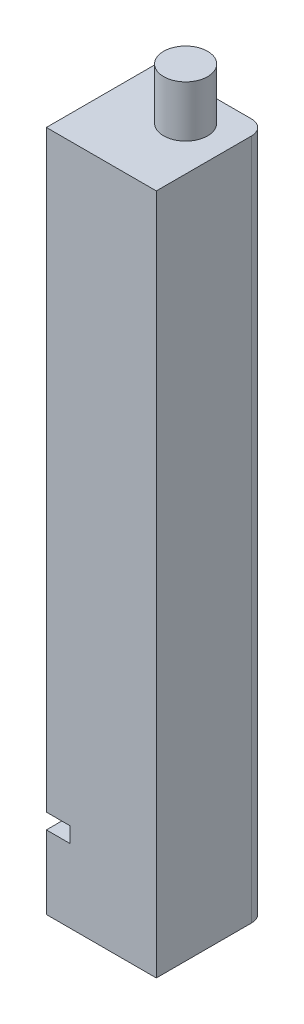
ISO-10303-21;
HEADER;
FILE_DESCRIPTION(('STEP AP214'),'2;1');
FILE_NAME('part.step','',(''),(''),'','','');
FILE_SCHEMA(('AUTOMOTIVE_DESIGN { 1 0 10303 214 1 1 1 1 }'));
ENDSEC;
DATA;
#1=APPLICATION_CONTEXT('core data for automotive mechanical design processes');
#2=APPLICATION_PROTOCOL_DEFINITION('international standard','automotive_design',2000,#1);
#3=PRODUCT_CONTEXT('',#1,'mechanical');
#4=PRODUCT('Part','Part','',(#3));
#5=PRODUCT_RELATED_PRODUCT_CATEGORY('part','',(#4));
#6=PRODUCT_DEFINITION_FORMATION('','',#4);
#7=PRODUCT_DEFINITION_CONTEXT('part definition',#1,'design');
#8=PRODUCT_DEFINITION('design','',#6,#7);
#9=PRODUCT_DEFINITION_SHAPE('','',#8);
#10=(LENGTH_UNIT() NAMED_UNIT(*) SI_UNIT(.MILLI.,.METRE.));
#11=(NAMED_UNIT(*) PLANE_ANGLE_UNIT() SI_UNIT($,.RADIAN.));
#12=(NAMED_UNIT(*) SI_UNIT($,.STERADIAN.) SOLID_ANGLE_UNIT());
#13=UNCERTAINTY_MEASURE_WITH_UNIT(LENGTH_MEASURE(1.E-05),#10,'distance_accuracy_value','');
#14=(GEOMETRIC_REPRESENTATION_CONTEXT(3) GLOBAL_UNCERTAINTY_ASSIGNED_CONTEXT((#13)) GLOBAL_UNIT_ASSIGNED_CONTEXT((#10,
#11,#12)) REPRESENTATION_CONTEXT('',''));
#15=CARTESIAN_POINT('',(0.,0.,0.));
#16=DIRECTION('',(0.,0.,1.));
#17=DIRECTION('',(1.,0.,0.));
#18=AXIS2_PLACEMENT_3D('',#15,#16,#17);
#19=CARTESIAN_POINT('',(-7.5,93.,7.5));
#20=DIRECTION('',(1.,0.,0.));
#21=DIRECTION('',(0.,0.,-1.));
#22=AXIS2_PLACEMENT_3D('',#19,#20,#21);
#23=PLANE('',#22);
#24=DIRECTION('',(0.,-1.,0.));
#25=VECTOR('',#24,1.);
#26=CARTESIAN_POINT('',(-7.5,93.,-7.5));
#27=LINE('',#26,#25);
#28=CARTESIAN_POINT('',(-7.5,93.,-7.5));
#29=VERTEX_POINT('',#28);
#30=CARTESIAN_POINT('',(-7.5,12.1,-7.5));
#31=VERTEX_POINT('',#30);
#32=EDGE_CURVE('E130',#29,#31,#27,.T.);
#33=ORIENTED_EDGE('',*,*,#32,.T.);
#34=DIRECTION('',(0.,0.,1.));
#35=VECTOR('',#34,1.);
#36=CARTESIAN_POINT('',(-7.5,12.1,-7.5));
#37=LINE('',#36,#35);
#38=CARTESIAN_POINT('',(-7.5,12.1,7.5));
#39=VERTEX_POINT('',#38);
#40=EDGE_CURVE('E193',#31,#39,#37,.T.);
#41=ORIENTED_EDGE('',*,*,#40,.T.);
#42=DIRECTION('',(0.,-1.,0.));
#43=VECTOR('',#42,1.);
#44=CARTESIAN_POINT('',(-7.5,93.,7.5));
#45=LINE('',#44,#43);
#46=CARTESIAN_POINT('',(-7.5,93.,7.5));
#47=VERTEX_POINT('',#46);
#48=EDGE_CURVE('E131',#47,#39,#45,.T.);
#49=ORIENTED_EDGE('',*,*,#48,.F.);
#50=DIRECTION('',(0.,0.,1.));
#51=VECTOR('',#50,1.);
#52=CARTESIAN_POINT('',(-7.5,93.,7.5));
#53=LINE('',#52,#51);
#54=EDGE_CURVE('E154',#29,#47,#53,.T.);
#55=ORIENTED_EDGE('',*,*,#54,.F.);
#56=EDGE_LOOP('',(#33,#41,#49,#55));
#57=FACE_BOUND('',#56,.T.);
#58=ADVANCED_FACE('F32',(#57),#23,.F.);
#59=CARTESIAN_POINT('',(7.5,93.,7.5));
#60=DIRECTION('',(-1.,0.,0.));
#61=DIRECTION('',(0.,0.,1.));
#62=AXIS2_PLACEMENT_3D('',#59,#60,#61);
#63=PLANE('',#62);
#64=DIRECTION('',(0.,0.,-1.));
#65=VECTOR('',#64,1.);
#66=CARTESIAN_POINT('',(7.5,0.,7.5));
#67=LINE('',#66,#65);
#68=CARTESIAN_POINT('',(7.5,0.,7.5));
#69=VERTEX_POINT('',#68);
#70=CARTESIAN_POINT('',(7.5,0.,-5.5));
#71=VERTEX_POINT('',#70);
#72=EDGE_CURVE('E159',#69,#71,#67,.T.);
#73=ORIENTED_EDGE('',*,*,#72,.T.);
#74=DIRECTION('',(0.,-1.,0.));
#75=VECTOR('',#74,1.);
#76=CARTESIAN_POINT('',(7.5,93.,-5.5));
#77=LINE('',#76,#75);
#78=CARTESIAN_POINT('',(7.5,93.,-5.5));
#79=VERTEX_POINT('',#78);
#80=EDGE_CURVE('E40',#71,#79,#77,.F.);
#81=ORIENTED_EDGE('',*,*,#80,.T.);
#82=DIRECTION('',(0.,0.,-1.));
#83=VECTOR('',#82,1.);
#84=CARTESIAN_POINT('',(7.5,93.,7.5));
#85=LINE('',#84,#83);
#86=CARTESIAN_POINT('',(7.5,93.,7.5));
#87=VERTEX_POINT('',#86);
#88=EDGE_CURVE('E149',#87,#79,#85,.T.);
#89=ORIENTED_EDGE('',*,*,#88,.F.);
#90=DIRECTION('',(0.,-1.,0.));
#91=VECTOR('',#90,1.);
#92=CARTESIAN_POINT('',(7.5,93.,7.5));
#93=LINE('',#92,#91);
#94=EDGE_CURVE('E158',#87,#69,#93,.T.);
#95=ORIENTED_EDGE('',*,*,#94,.T.);
#96=EDGE_LOOP('',(#73,#81,#89,#95));
#97=FACE_BOUND('',#96,.T.);
#98=ADVANCED_FACE('F172',(#97),#63,.F.);
#99=CARTESIAN_POINT('',(-7.5,93.,-7.5));
#100=DIRECTION('',(0.,0.,1.));
#101=DIRECTION('',(1.,0.,0.));
#102=AXIS2_PLACEMENT_3D('',#99,#100,#101);
#103=PLANE('',#102);
#104=DIRECTION('',(-1.,0.,0.));
#105=VECTOR('',#104,1.);
#106=CARTESIAN_POINT('',(-7.5,93.,-7.5));
#107=LINE('',#106,#105);
#108=CARTESIAN_POINT('',(5.49999999999999,93.,-7.5));
#109=VERTEX_POINT('',#108);
#110=EDGE_CURVE('E151',#109,#29,#107,.T.);
#111=ORIENTED_EDGE('',*,*,#110,.F.);
#112=DIRECTION('',(0.,-1.,0.));
#113=VECTOR('',#112,1.);
#114=CARTESIAN_POINT('',(5.5,93.,-7.5));
#115=LINE('',#114,#113);
#116=CARTESIAN_POINT('',(5.49999999999999,0.,-7.5));
#117=VERTEX_POINT('',#116);
#118=EDGE_CURVE('E139',#109,#117,#115,.T.);
#119=ORIENTED_EDGE('',*,*,#118,.T.);
#120=DIRECTION('',(-1.,0.,0.));
#121=VECTOR('',#120,1.);
#122=CARTESIAN_POINT('',(-7.5,0.,-7.5));
#123=LINE('',#122,#121);
#124=CARTESIAN_POINT('',(-7.5,0.,-7.5));
#125=VERTEX_POINT('',#124);
#126=EDGE_CURVE('E129',#117,#125,#123,.T.);
#127=ORIENTED_EDGE('',*,*,#126,.T.);
#128=CARTESIAN_POINT('',(-7.5,10.,-7.5));
#129=VERTEX_POINT('',#128);
#130=EDGE_CURVE('E121',#129,#125,#27,.T.);
#131=ORIENTED_EDGE('',*,*,#130,.F.);
#132=DIRECTION('',(1.,0.,0.));
#133=VECTOR('',#132,1.);
#134=CARTESIAN_POINT('',(-4.3,10.,-7.5));
#135=LINE('',#134,#133);
#136=CARTESIAN_POINT('',(-4.3,10.,-7.5));
#137=VERTEX_POINT('',#136);
#138=EDGE_CURVE('E102',#129,#137,#135,.T.);
#139=ORIENTED_EDGE('',*,*,#138,.T.);
#140=DIRECTION('',(0.,1.,0.));
#141=VECTOR('',#140,1.);
#142=CARTESIAN_POINT('',(-4.30000000000001,12.1,-7.5));
#143=LINE('',#142,#141);
#144=CARTESIAN_POINT('',(-4.30000000000001,12.1,-7.5));
#145=VERTEX_POINT('',#144);
#146=EDGE_CURVE('E113',#137,#145,#143,.T.);
#147=ORIENTED_EDGE('',*,*,#146,.T.);
#148=DIRECTION('',(-1.,0.,0.));
#149=VECTOR('',#148,1.);
#150=CARTESIAN_POINT('',(-7.5,12.1,-7.5));
#151=LINE('',#150,#149);
#152=EDGE_CURVE('E124',#145,#31,#151,.T.);
#153=ORIENTED_EDGE('',*,*,#152,.T.);
#154=ORIENTED_EDGE('',*,*,#32,.F.);
#155=EDGE_LOOP('',(#111,#119,#127,#131,#139,#147,#153,#154));
#156=FACE_BOUND('',#155,.T.);
#157=ADVANCED_FACE('F127',(#156),#103,.F.);
#158=CARTESIAN_POINT('',(-7.5,10.,7.5));
#159=VERTEX_POINT('',#158);
#160=CARTESIAN_POINT('',(-7.5,0.,7.5));
#161=VERTEX_POINT('',#160);
#162=EDGE_CURVE('E123',#159,#161,#45,.T.);
#163=ORIENTED_EDGE('',*,*,#162,.F.);
#164=DIRECTION('',(0.,0.,1.));
#165=VECTOR('',#164,1.);
#166=CARTESIAN_POINT('',(-7.5,10.,-7.5));
#167=LINE('',#166,#165);
#168=EDGE_CURVE('E106',#129,#159,#167,.T.);
#169=ORIENTED_EDGE('',*,*,#168,.F.);
#170=ORIENTED_EDGE('',*,*,#130,.T.);
#171=DIRECTION('',(0.,0.,1.));
#172=VECTOR('',#171,1.);
#173=CARTESIAN_POINT('',(-7.5,0.,7.5));
#174=LINE('',#173,#172);
#175=EDGE_CURVE('E162',#125,#161,#174,.T.);
#176=ORIENTED_EDGE('',*,*,#175,.T.);
#177=EDGE_LOOP('',(#163,#169,#170,#176));
#178=FACE_BOUND('',#177,.T.);
#179=ADVANCED_FACE('F119',(#178),#23,.F.);
#180=CARTESIAN_POINT('',(-7.5,93.,7.5));
#181=DIRECTION('',(0.,0.,-1.));
#182=DIRECTION('',(-1.,0.,0.));
#183=AXIS2_PLACEMENT_3D('',#180,#181,#182);
#184=PLANE('',#183);
#185=ORIENTED_EDGE('',*,*,#48,.T.);
#186=DIRECTION('',(-1.,0.,0.));
#187=VECTOR('',#186,1.);
#188=CARTESIAN_POINT('',(-7.5,12.1,7.5));
#189=LINE('',#188,#187);
#190=CARTESIAN_POINT('',(-4.30000000000001,12.1,7.5));
#191=VERTEX_POINT('',#190);
#192=EDGE_CURVE('E114',#191,#39,#189,.T.);
#193=ORIENTED_EDGE('',*,*,#192,.F.);
#194=DIRECTION('',(0.,1.,0.));
#195=VECTOR('',#194,1.);
#196=CARTESIAN_POINT('',(-4.30000000000001,12.1,7.5));
#197=LINE('',#196,#195);
#198=CARTESIAN_POINT('',(-4.3,10.,7.5));
#199=VERTEX_POINT('',#198);
#200=EDGE_CURVE('E187',#199,#191,#197,.T.);
#201=ORIENTED_EDGE('',*,*,#200,.F.);
#202=DIRECTION('',(1.,0.,0.));
#203=VECTOR('',#202,1.);
#204=CARTESIAN_POINT('',(-4.3,10.,7.5));
#205=LINE('',#204,#203);
#206=EDGE_CURVE('E170',#159,#199,#205,.T.);
#207=ORIENTED_EDGE('',*,*,#206,.F.);
#208=ORIENTED_EDGE('',*,*,#162,.T.);
#209=DIRECTION('',(1.,0.,0.));
#210=VECTOR('',#209,1.);
#211=CARTESIAN_POINT('',(-7.5,0.,7.5));
#212=LINE('',#211,#210);
#213=EDGE_CURVE('E152',#161,#69,#212,.T.);
#214=ORIENTED_EDGE('',*,*,#213,.T.);
#215=ORIENTED_EDGE('',*,*,#94,.F.);
#216=DIRECTION('',(1.,0.,0.));
#217=VECTOR('',#216,1.);
#218=CARTESIAN_POINT('',(-7.5,93.,7.5));
#219=LINE('',#218,#217);
#220=EDGE_CURVE('E156',#47,#87,#219,.T.);
#221=ORIENTED_EDGE('',*,*,#220,.F.);
#222=EDGE_LOOP('',(#185,#193,#201,#207,#208,#214,#215,#221));
#223=FACE_BOUND('',#222,.T.);
#224=ADVANCED_FACE('F167',(#223),#184,.F.);
#225=CARTESIAN_POINT('',(0.,93.,0.));
#226=DIRECTION('',(0.,-1.,0.));
#227=DIRECTION('',(0.,0.,-1.));
#228=AXIS2_PLACEMENT_3D('',#225,#226,#227);
#229=PLANE('',#228);
#230=CARTESIAN_POINT('',(1.5,93.,-2.5));
#231=DIRECTION('',(0.,1.,0.));
#232=DIRECTION('',(0.,0.,1.));
#233=AXIS2_PLACEMENT_3D('',#230,#231,#232);
#234=CIRCLE('',#233,3.);
#235=CARTESIAN_POINT('',(1.5,93.,0.500000000000004));
#236=VERTEX_POINT('',#235);
#237=EDGE_CURVE('E134',#236,#236,#234,.T.);
#238=ORIENTED_EDGE('',*,*,#237,.F.);
#239=EDGE_LOOP('',(#238));
#240=FACE_BOUND('',#239,.T.);
#241=ORIENTED_EDGE('',*,*,#88,.T.);
#242=CARTESIAN_POINT('',(5.5,93.,-5.5));
#243=DIRECTION('',(0.,-1.,0.));
#244=DIRECTION('',(0.,0.,-1.));
#245=AXIS2_PLACEMENT_3D('',#242,#243,#244);
#246=CIRCLE('',#245,2.);
#247=EDGE_CURVE('E11',#79,#109,#246,.F.);
#248=ORIENTED_EDGE('',*,*,#247,.T.);
#249=ORIENTED_EDGE('',*,*,#110,.T.);
#250=ORIENTED_EDGE('',*,*,#54,.T.);
#251=ORIENTED_EDGE('',*,*,#220,.T.);
#252=EDGE_LOOP('',(#241,#248,#249,#250,#251));
#253=FACE_BOUND('',#252,.T.);
#254=ADVANCED_FACE('F176',(#240,#253),#229,.F.);
#255=CARTESIAN_POINT('',(0.,0.,0.));
#256=DIRECTION('',(0.,-1.,0.));
#257=DIRECTION('',(0.,0.,-1.));
#258=AXIS2_PLACEMENT_3D('',#255,#256,#257);
#259=PLANE('',#258);
#260=ORIENTED_EDGE('',*,*,#126,.F.);
#261=CARTESIAN_POINT('',(5.5,0.,-5.5));
#262=DIRECTION('',(0.,-1.,0.));
#263=DIRECTION('',(0.,0.,-1.));
#264=AXIS2_PLACEMENT_3D('',#261,#262,#263);
#265=CIRCLE('',#264,2.);
#266=EDGE_CURVE('E54',#117,#71,#265,.T.);
#267=ORIENTED_EDGE('',*,*,#266,.T.);
#268=ORIENTED_EDGE('',*,*,#72,.F.);
#269=ORIENTED_EDGE('',*,*,#213,.F.);
#270=ORIENTED_EDGE('',*,*,#175,.F.);
#271=EDGE_LOOP('',(#260,#267,#268,#269,#270));
#272=FACE_BOUND('',#271,.T.);
#273=ADVANCED_FACE('F171',(#272),#259,.T.);
#274=CARTESIAN_POINT('',(1.5,100.,-2.5));
#275=DIRECTION('',(0.,-1.,0.));
#276=DIRECTION('',(0.,0.,-1.));
#277=AXIS2_PLACEMENT_3D('',#274,#275,#276);
#278=CYLINDRICAL_SURFACE('',#277,3.);
#279=CARTESIAN_POINT('',(1.5,100.,-2.5));
#280=DIRECTION('',(0.,1.,0.));
#281=DIRECTION('',(0.,0.,1.));
#282=AXIS2_PLACEMENT_3D('',#279,#280,#281);
#283=CIRCLE('',#282,3.);
#284=CARTESIAN_POINT('',(1.5,100.,0.500000000000004));
#285=VERTEX_POINT('',#284);
#286=EDGE_CURVE('E148',#285,#285,#283,.T.);
#287=ORIENTED_EDGE('',*,*,#286,.F.);
#288=EDGE_LOOP('',(#287));
#289=FACE_BOUND('',#288,.T.);
#290=ORIENTED_EDGE('',*,*,#237,.T.);
#291=EDGE_LOOP('',(#290));
#292=FACE_BOUND('',#291,.T.);
#293=ADVANCED_FACE('F210',(#289,#292),#278,.T.);
#294=CARTESIAN_POINT('',(1.5,100.,-2.5));
#295=DIRECTION('',(0.,1.,0.));
#296=DIRECTION('',(0.,0.,1.));
#297=AXIS2_PLACEMENT_3D('',#294,#295,#296);
#298=PLANE('',#297);
#299=ORIENTED_EDGE('',*,*,#286,.T.);
#300=EDGE_LOOP('',(#299));
#301=FACE_BOUND('',#300,.T.);
#302=ADVANCED_FACE('F203',(#301),#298,.T.);
#303=CARTESIAN_POINT('',(-7.5,12.1,-7.5));
#304=DIRECTION('',(0.,1.,0.));
#305=DIRECTION('',(-1.,0.,0.));
#306=AXIS2_PLACEMENT_3D('',#303,#304,#305);
#307=PLANE('',#306);
#308=ORIENTED_EDGE('',*,*,#192,.T.);
#309=ORIENTED_EDGE('',*,*,#40,.F.);
#310=ORIENTED_EDGE('',*,*,#152,.F.);
#311=DIRECTION('',(0.,0.,1.));
#312=VECTOR('',#311,1.);
#313=CARTESIAN_POINT('',(-4.30000000000001,12.1,-7.5));
#314=LINE('',#313,#312);
#315=EDGE_CURVE('E195',#145,#191,#314,.T.);
#316=ORIENTED_EDGE('',*,*,#315,.T.);
#317=EDGE_LOOP('',(#308,#309,#310,#316));
#318=FACE_BOUND('',#317,.T.);
#319=ADVANCED_FACE('F201',(#318),#307,.F.);
#320=CARTESIAN_POINT('',(-4.30000000000001,12.1,-7.5));
#321=DIRECTION('',(1.,0.,0.));
#322=DIRECTION('',(0.,1.,0.));
#323=AXIS2_PLACEMENT_3D('',#320,#321,#322);
#324=PLANE('',#323);
#325=ORIENTED_EDGE('',*,*,#200,.T.);
#326=ORIENTED_EDGE('',*,*,#315,.F.);
#327=ORIENTED_EDGE('',*,*,#146,.F.);
#328=DIRECTION('',(0.,0.,1.));
#329=VECTOR('',#328,1.);
#330=CARTESIAN_POINT('',(-4.3,10.,-7.5));
#331=LINE('',#330,#329);
#332=EDGE_CURVE('E108',#137,#199,#331,.T.);
#333=ORIENTED_EDGE('',*,*,#332,.T.);
#334=EDGE_LOOP('',(#325,#326,#327,#333));
#335=FACE_BOUND('',#334,.T.);
#336=ADVANCED_FACE('F198',(#335),#324,.F.);
#337=CARTESIAN_POINT('',(-4.3,10.,-7.5));
#338=DIRECTION('',(0.,-1.,0.));
#339=DIRECTION('',(0.,0.,-1.));
#340=AXIS2_PLACEMENT_3D('',#337,#338,#339);
#341=PLANE('',#340);
#342=ORIENTED_EDGE('',*,*,#206,.T.);
#343=ORIENTED_EDGE('',*,*,#332,.F.);
#344=ORIENTED_EDGE('',*,*,#138,.F.);
#345=ORIENTED_EDGE('',*,*,#168,.T.);
#346=EDGE_LOOP('',(#342,#343,#344,#345));
#347=FACE_BOUND('',#346,.T.);
#348=ADVANCED_FACE('F105',(#347),#341,.F.);
#349=CARTESIAN_POINT('',(5.5,93.,-5.5));
#350=DIRECTION('',(0.,-1.,0.));
#351=DIRECTION('',(0.,0.,-1.));
#352=AXIS2_PLACEMENT_3D('',#349,#350,#351);
#353=CYLINDRICAL_SURFACE('',#352,2.);
#354=ORIENTED_EDGE('',*,*,#247,.F.);
#355=ORIENTED_EDGE('',*,*,#80,.F.);
#356=ORIENTED_EDGE('',*,*,#266,.F.);
#357=ORIENTED_EDGE('',*,*,#118,.F.);
#358=EDGE_LOOP('',(#354,#355,#356,#357));
#359=FACE_BOUND('',#358,.T.);
#360=ADVANCED_FACE('F34',(#359),#353,.T.);
#361=CLOSED_SHELL('',(#58,#98,#157,#179,#224,#254,#273,#293,#302,#319,#336,#348,#360));
#362=MANIFOLD_SOLID_BREP('B2',#361);
#363=ADVANCED_BREP_SHAPE_REPRESENTATION('',(#18,#362),#14);
#364=SHAPE_DEFINITION_REPRESENTATION(#9,#363);
ENDSEC;
END-ISO-10303-21;
